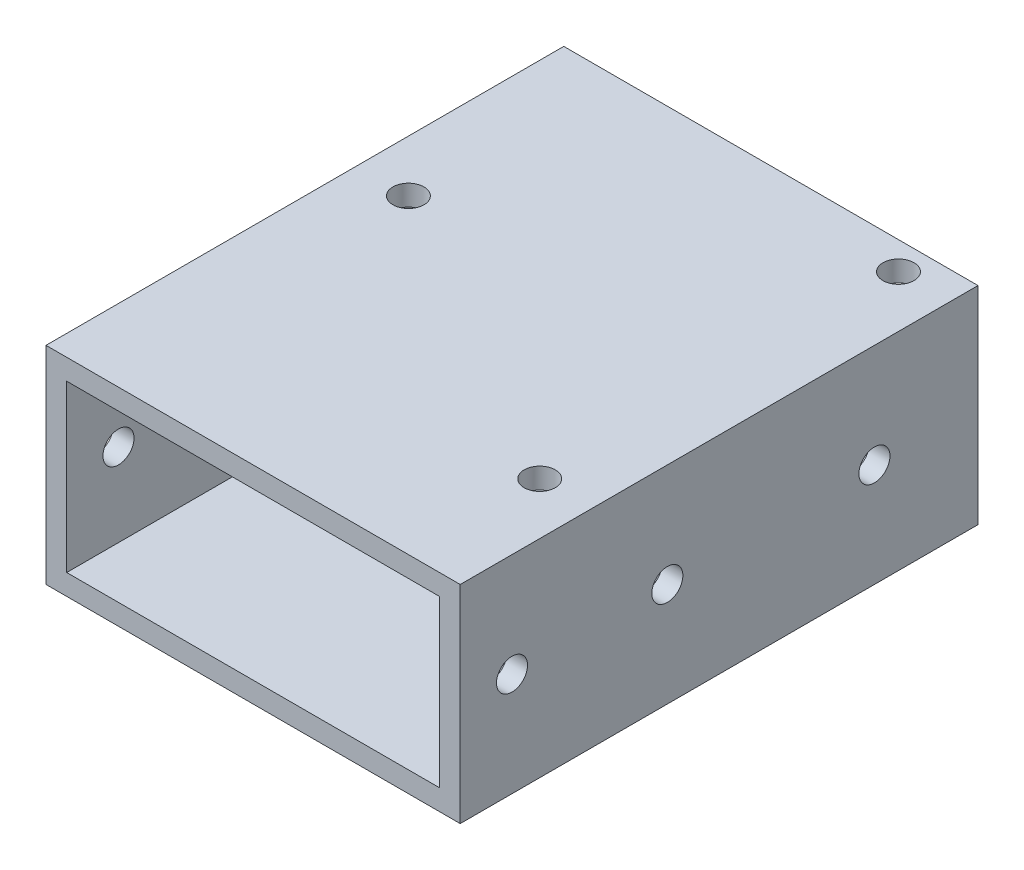
ISO-10303-21;
HEADER;
FILE_DESCRIPTION(('STEP AP214'),'2;1');
FILE_NAME('part.step','',(''),(''),'','','');
FILE_SCHEMA(('AUTOMOTIVE_DESIGN { 1 0 10303 214 1 1 1 1 }'));
ENDSEC;
DATA;
#1=APPLICATION_CONTEXT('core data for automotive mechanical design processes');
#2=APPLICATION_PROTOCOL_DEFINITION('international standard','automotive_design',2000,#1);
#3=PRODUCT_CONTEXT('',#1,'mechanical');
#4=PRODUCT('Part','Part','',(#3));
#5=PRODUCT_RELATED_PRODUCT_CATEGORY('part','',(#4));
#6=PRODUCT_DEFINITION_FORMATION('','',#4);
#7=PRODUCT_DEFINITION_CONTEXT('part definition',#1,'design');
#8=PRODUCT_DEFINITION('design','',#6,#7);
#9=PRODUCT_DEFINITION_SHAPE('','',#8);
#10=(LENGTH_UNIT() NAMED_UNIT(*) SI_UNIT(.MILLI.,.METRE.));
#11=(NAMED_UNIT(*) PLANE_ANGLE_UNIT() SI_UNIT($,.RADIAN.));
#12=(NAMED_UNIT(*) SI_UNIT($,.STERADIAN.) SOLID_ANGLE_UNIT());
#13=UNCERTAINTY_MEASURE_WITH_UNIT(LENGTH_MEASURE(1.E-05),#10,'distance_accuracy_value','');
#14=(GEOMETRIC_REPRESENTATION_CONTEXT(3) GLOBAL_UNCERTAINTY_ASSIGNED_CONTEXT((#13)) GLOBAL_UNIT_ASSIGNED_CONTEXT((#10,
#11,#12)) REPRESENTATION_CONTEXT('',''));
#15=CARTESIAN_POINT('',(0.,0.,0.));
#16=DIRECTION('',(0.,0.,1.));
#17=DIRECTION('',(1.,0.,0.));
#18=AXIS2_PLACEMENT_3D('',#15,#16,#17);
#19=CARTESIAN_POINT('',(0.,0.,50.));
#20=DIRECTION('',(0.,0.,1.));
#21=DIRECTION('',(1.,0.,0.));
#22=AXIS2_PLACEMENT_3D('',#19,#20,#21);
#23=PLANE('',#22);
#24=DIRECTION('',(0.,1.,0.));
#25=VECTOR('',#24,1.);
#26=CARTESIAN_POINT('',(20.,10.,50.));
#27=LINE('',#26,#25);
#28=CARTESIAN_POINT('',(20.,-10.,50.));
#29=VERTEX_POINT('',#28);
#30=CARTESIAN_POINT('',(20.,10.,50.));
#31=VERTEX_POINT('',#30);
#32=EDGE_CURVE('E144',#29,#31,#27,.T.);
#33=ORIENTED_EDGE('',*,*,#32,.T.);
#34=DIRECTION('',(-1.,0.,0.));
#35=VECTOR('',#34,1.);
#36=CARTESIAN_POINT('',(-20.,10.,50.));
#37=LINE('',#36,#35);
#38=CARTESIAN_POINT('',(-20.,10.,50.));
#39=VERTEX_POINT('',#38);
#40=EDGE_CURVE('E146',#31,#39,#37,.T.);
#41=ORIENTED_EDGE('',*,*,#40,.T.);
#42=DIRECTION('',(0.,-1.,0.));
#43=VECTOR('',#42,1.);
#44=CARTESIAN_POINT('',(-20.,10.,50.));
#45=LINE('',#44,#43);
#46=CARTESIAN_POINT('',(-20.,-10.,50.));
#47=VERTEX_POINT('',#46);
#48=EDGE_CURVE('E151',#39,#47,#45,.T.);
#49=ORIENTED_EDGE('',*,*,#48,.T.);
#50=DIRECTION('',(1.,0.,0.));
#51=VECTOR('',#50,1.);
#52=CARTESIAN_POINT('',(-20.,-10.,50.));
#53=LINE('',#52,#51);
#54=EDGE_CURVE('E153',#47,#29,#53,.T.);
#55=ORIENTED_EDGE('',*,*,#54,.T.);
#56=EDGE_LOOP('',(#33,#41,#49,#55));
#57=FACE_BOUND('',#56,.T.);
#58=DIRECTION('',(-1.,0.,0.));
#59=VECTOR('',#58,1.);
#60=CARTESIAN_POINT('',(-18.,8.,50.));
#61=LINE('',#60,#59);
#62=CARTESIAN_POINT('',(18.,8.,50.));
#63=VERTEX_POINT('',#62);
#64=CARTESIAN_POINT('',(-18.,8.,50.));
#65=VERTEX_POINT('',#64);
#66=EDGE_CURVE('E113',#63,#65,#61,.T.);
#67=ORIENTED_EDGE('',*,*,#66,.F.);
#68=DIRECTION('',(0.,1.,0.));
#69=VECTOR('',#68,1.);
#70=CARTESIAN_POINT('',(18.,8.,50.));
#71=LINE('',#70,#69);
#72=CARTESIAN_POINT('',(18.,-8.00000000000001,50.));
#73=VERTEX_POINT('',#72);
#74=EDGE_CURVE('E110',#73,#63,#71,.T.);
#75=ORIENTED_EDGE('',*,*,#74,.F.);
#76=DIRECTION('',(1.,0.,0.));
#77=VECTOR('',#76,1.);
#78=CARTESIAN_POINT('',(-18.,-8.00000000000001,50.));
#79=LINE('',#78,#77);
#80=CARTESIAN_POINT('',(-18.,-8.00000000000001,50.));
#81=VERTEX_POINT('',#80);
#82=EDGE_CURVE('E129',#81,#73,#79,.T.);
#83=ORIENTED_EDGE('',*,*,#82,.F.);
#84=DIRECTION('',(0.,-1.,0.));
#85=VECTOR('',#84,1.);
#86=CARTESIAN_POINT('',(-18.,8.,50.));
#87=LINE('',#86,#85);
#88=EDGE_CURVE('E130',#65,#81,#87,.T.);
#89=ORIENTED_EDGE('',*,*,#88,.F.);
#90=EDGE_LOOP('',(#67,#75,#83,#89));
#91=FACE_BOUND('',#90,.T.);
#92=ADVANCED_FACE('F37',(#57,#91),#23,.T.);
#93=CARTESIAN_POINT('',(0.,0.,0.));
#94=DIRECTION('',(0.,0.,1.));
#95=DIRECTION('',(1.,0.,0.));
#96=AXIS2_PLACEMENT_3D('',#93,#94,#95);
#97=PLANE('',#96);
#98=DIRECTION('',(0.,1.,0.));
#99=VECTOR('',#98,1.);
#100=CARTESIAN_POINT('',(20.,10.,0.));
#101=LINE('',#100,#99);
#102=CARTESIAN_POINT('',(20.,-10.,0.));
#103=VERTEX_POINT('',#102);
#104=CARTESIAN_POINT('',(20.,10.,0.));
#105=VERTEX_POINT('',#104);
#106=EDGE_CURVE('E124',#103,#105,#101,.T.);
#107=ORIENTED_EDGE('',*,*,#106,.F.);
#108=DIRECTION('',(1.,0.,0.));
#109=VECTOR('',#108,1.);
#110=CARTESIAN_POINT('',(-20.,-10.,0.));
#111=LINE('',#110,#109);
#112=CARTESIAN_POINT('',(-20.,-10.,0.));
#113=VERTEX_POINT('',#112);
#114=EDGE_CURVE('E149',#113,#103,#111,.T.);
#115=ORIENTED_EDGE('',*,*,#114,.F.);
#116=DIRECTION('',(0.,-1.,0.));
#117=VECTOR('',#116,1.);
#118=CARTESIAN_POINT('',(-20.,10.,0.));
#119=LINE('',#118,#117);
#120=CARTESIAN_POINT('',(-20.,10.,0.));
#121=VERTEX_POINT('',#120);
#122=EDGE_CURVE('E159',#121,#113,#119,.T.);
#123=ORIENTED_EDGE('',*,*,#122,.F.);
#124=DIRECTION('',(-1.,0.,0.));
#125=VECTOR('',#124,1.);
#126=CARTESIAN_POINT('',(-20.,10.,0.));
#127=LINE('',#126,#125);
#128=EDGE_CURVE('E158',#105,#121,#127,.T.);
#129=ORIENTED_EDGE('',*,*,#128,.F.);
#130=EDGE_LOOP('',(#107,#115,#123,#129));
#131=FACE_BOUND('',#130,.T.);
#132=DIRECTION('',(0.,1.,0.));
#133=VECTOR('',#132,1.);
#134=CARTESIAN_POINT('',(18.,8.,0.));
#135=LINE('',#134,#133);
#136=CARTESIAN_POINT('',(18.,-8.00000000000001,0.));
#137=VERTEX_POINT('',#136);
#138=CARTESIAN_POINT('',(18.,8.,0.));
#139=VERTEX_POINT('',#138);
#140=EDGE_CURVE('E62',#137,#139,#135,.T.);
#141=ORIENTED_EDGE('',*,*,#140,.T.);
#142=DIRECTION('',(-1.,0.,0.));
#143=VECTOR('',#142,1.);
#144=CARTESIAN_POINT('',(-18.,8.,0.));
#145=LINE('',#144,#143);
#146=CARTESIAN_POINT('',(-18.,8.,0.));
#147=VERTEX_POINT('',#146);
#148=EDGE_CURVE('E122',#139,#147,#145,.T.);
#149=ORIENTED_EDGE('',*,*,#148,.T.);
#150=DIRECTION('',(0.,-1.,0.));
#151=VECTOR('',#150,1.);
#152=CARTESIAN_POINT('',(-18.,8.,0.));
#153=LINE('',#152,#151);
#154=CARTESIAN_POINT('',(-18.,-8.00000000000001,0.));
#155=VERTEX_POINT('',#154);
#156=EDGE_CURVE('E137',#147,#155,#153,.T.);
#157=ORIENTED_EDGE('',*,*,#156,.T.);
#158=DIRECTION('',(1.,0.,0.));
#159=VECTOR('',#158,1.);
#160=CARTESIAN_POINT('',(-18.,-8.00000000000001,0.));
#161=LINE('',#160,#159);
#162=EDGE_CURVE('E118',#155,#137,#161,.T.);
#163=ORIENTED_EDGE('',*,*,#162,.T.);
#164=EDGE_LOOP('',(#141,#149,#157,#163));
#165=FACE_BOUND('',#164,.T.);
#166=ADVANCED_FACE('F259',(#131,#165),#97,.F.);
#167=CARTESIAN_POINT('',(20.,10.,50.));
#168=DIRECTION('',(-1.,0.,0.));
#169=DIRECTION('',(0.,-1.,0.));
#170=AXIS2_PLACEMENT_3D('',#167,#168,#169);
#171=PLANE('',#170);
#172=CARTESIAN_POINT('',(20.,0.,10.));
#173=DIRECTION('',(-1.,0.,0.));
#174=DIRECTION('',(0.,-1.,0.));
#175=AXIS2_PLACEMENT_3D('',#172,#173,#174);
#176=CIRCLE('',#175,1.5);
#177=CARTESIAN_POINT('',(20.,-1.5,10.));
#178=VERTEX_POINT('',#177);
#179=EDGE_CURVE('E211',#178,#178,#176,.T.);
#180=ORIENTED_EDGE('',*,*,#179,.T.);
#181=EDGE_LOOP('',(#180));
#182=FACE_BOUND('',#181,.T.);
#183=CARTESIAN_POINT('',(20.,0.,30.));
#184=DIRECTION('',(-1.,0.,0.));
#185=DIRECTION('',(0.,-1.,0.));
#186=AXIS2_PLACEMENT_3D('',#183,#184,#185);
#187=CIRCLE('',#186,1.5);
#188=CARTESIAN_POINT('',(20.,-1.5,30.));
#189=VERTEX_POINT('',#188);
#190=EDGE_CURVE('E198',#189,#189,#187,.T.);
#191=ORIENTED_EDGE('',*,*,#190,.T.);
#192=EDGE_LOOP('',(#191));
#193=FACE_BOUND('',#192,.T.);
#194=CARTESIAN_POINT('',(20.,0.,45.));
#195=DIRECTION('',(-1.,0.,0.));
#196=DIRECTION('',(0.,-1.,0.));
#197=AXIS2_PLACEMENT_3D('',#194,#195,#196);
#198=CIRCLE('',#197,1.5);
#199=CARTESIAN_POINT('',(20.,-1.5,45.));
#200=VERTEX_POINT('',#199);
#201=EDGE_CURVE('E192',#200,#200,#198,.T.);
#202=ORIENTED_EDGE('',*,*,#201,.T.);
#203=EDGE_LOOP('',(#202));
#204=FACE_BOUND('',#203,.T.);
#205=ORIENTED_EDGE('',*,*,#106,.T.);
#206=DIRECTION('',(0.,0.,-1.));
#207=VECTOR('',#206,1.);
#208=CARTESIAN_POINT('',(20.,10.,50.));
#209=LINE('',#208,#207);
#210=EDGE_CURVE('E11',#31,#105,#209,.T.);
#211=ORIENTED_EDGE('',*,*,#210,.F.);
#212=ORIENTED_EDGE('',*,*,#32,.F.);
#213=DIRECTION('',(0.,0.,-1.));
#214=VECTOR('',#213,1.);
#215=CARTESIAN_POINT('',(20.,-10.,50.));
#216=LINE('',#215,#214);
#217=EDGE_CURVE('E154',#29,#103,#216,.T.);
#218=ORIENTED_EDGE('',*,*,#217,.T.);
#219=EDGE_LOOP('',(#205,#211,#212,#218));
#220=FACE_BOUND('',#219,.T.);
#221=ADVANCED_FACE('F45',(#182,#193,#204,#220),#171,.F.);
#222=CARTESIAN_POINT('',(-20.,10.,50.));
#223=DIRECTION('',(0.,-1.,0.));
#224=DIRECTION('',(0.,0.,-1.));
#225=AXIS2_PLACEMENT_3D('',#222,#223,#224);
#226=PLANE('',#225);
#227=CARTESIAN_POINT('',(-15.,10.,20.));
#228=DIRECTION('',(0.,1.,0.));
#229=DIRECTION('',(0.,0.,1.));
#230=AXIS2_PLACEMENT_3D('',#227,#228,#229);
#231=CIRCLE('',#230,1.5);
#232=CARTESIAN_POINT('',(-15.,10.,21.5));
#233=VERTEX_POINT('',#232);
#234=EDGE_CURVE('E174',#233,#233,#231,.T.);
#235=ORIENTED_EDGE('',*,*,#234,.F.);
#236=EDGE_LOOP('',(#235));
#237=FACE_BOUND('',#236,.T.);
#238=CARTESIAN_POINT('',(15.0000000000001,10.,2.67949192431127));
#239=DIRECTION('',(0.,1.,0.));
#240=DIRECTION('',(0.,0.,1.));
#241=AXIS2_PLACEMENT_3D('',#238,#239,#240);
#242=CIRCLE('',#241,1.5);
#243=CARTESIAN_POINT('',(15.0000000000001,10.,4.17949192431127));
#244=VERTEX_POINT('',#243);
#245=EDGE_CURVE('E220',#244,#244,#242,.T.);
#246=ORIENTED_EDGE('',*,*,#245,.F.);
#247=EDGE_LOOP('',(#246));
#248=FACE_BOUND('',#247,.T.);
#249=CARTESIAN_POINT('',(15.0000000000001,10.,37.3205080756887));
#250=DIRECTION('',(0.,1.,0.));
#251=DIRECTION('',(0.,0.,1.));
#252=AXIS2_PLACEMENT_3D('',#249,#250,#251);
#253=CIRCLE('',#252,1.5);
#254=CARTESIAN_POINT('',(15.0000000000001,10.,38.8205080756887));
#255=VERTEX_POINT('',#254);
#256=EDGE_CURVE('E212',#255,#255,#253,.T.);
#257=ORIENTED_EDGE('',*,*,#256,.F.);
#258=EDGE_LOOP('',(#257));
#259=FACE_BOUND('',#258,.T.);
#260=ORIENTED_EDGE('',*,*,#128,.T.);
#261=DIRECTION('',(0.,0.,-1.));
#262=VECTOR('',#261,1.);
#263=CARTESIAN_POINT('',(-20.,10.,50.));
#264=LINE('',#263,#262);
#265=EDGE_CURVE('E47',#39,#121,#264,.T.);
#266=ORIENTED_EDGE('',*,*,#265,.F.);
#267=ORIENTED_EDGE('',*,*,#40,.F.);
#268=ORIENTED_EDGE('',*,*,#210,.T.);
#269=EDGE_LOOP('',(#260,#266,#267,#268));
#270=FACE_BOUND('',#269,.T.);
#271=ADVANCED_FACE('F273',(#237,#248,#259,#270),#226,.F.);
#272=CARTESIAN_POINT('',(-20.,10.,50.));
#273=DIRECTION('',(1.,0.,0.));
#274=DIRECTION('',(0.,1.,0.));
#275=AXIS2_PLACEMENT_3D('',#272,#273,#274);
#276=PLANE('',#275);
#277=CARTESIAN_POINT('',(-20.,0.,10.));
#278=DIRECTION('',(-1.,0.,0.));
#279=DIRECTION('',(0.,-1.,0.));
#280=AXIS2_PLACEMENT_3D('',#277,#278,#279);
#281=CIRCLE('',#280,1.5);
#282=CARTESIAN_POINT('',(-20.,-1.5,10.));
#283=VERTEX_POINT('',#282);
#284=EDGE_CURVE('E186',#283,#283,#281,.T.);
#285=ORIENTED_EDGE('',*,*,#284,.F.);
#286=EDGE_LOOP('',(#285));
#287=FACE_BOUND('',#286,.T.);
#288=CARTESIAN_POINT('',(-20.,0.,30.));
#289=DIRECTION('',(-1.,0.,0.));
#290=DIRECTION('',(0.,-1.,0.));
#291=AXIS2_PLACEMENT_3D('',#288,#289,#290);
#292=CIRCLE('',#291,1.5);
#293=CARTESIAN_POINT('',(-20.,-1.50000000000001,30.));
#294=VERTEX_POINT('',#293);
#295=EDGE_CURVE('E488',#294,#294,#292,.T.);
#296=ORIENTED_EDGE('',*,*,#295,.F.);
#297=EDGE_LOOP('',(#296));
#298=FACE_BOUND('',#297,.T.);
#299=CARTESIAN_POINT('',(-20.,0.,45.));
#300=DIRECTION('',(-1.,0.,0.));
#301=DIRECTION('',(0.,-1.,0.));
#302=AXIS2_PLACEMENT_3D('',#299,#300,#301);
#303=CIRCLE('',#302,1.5);
#304=CARTESIAN_POINT('',(-20.,-1.50000000000001,45.));
#305=VERTEX_POINT('',#304);
#306=EDGE_CURVE('E491',#305,#305,#303,.T.);
#307=ORIENTED_EDGE('',*,*,#306,.F.);
#308=EDGE_LOOP('',(#307));
#309=FACE_BOUND('',#308,.T.);
#310=ORIENTED_EDGE('',*,*,#122,.T.);
#311=DIRECTION('',(0.,0.,-1.));
#312=VECTOR('',#311,1.);
#313=CARTESIAN_POINT('',(-20.,-10.,50.));
#314=LINE('',#313,#312);
#315=EDGE_CURVE('E164',#47,#113,#314,.T.);
#316=ORIENTED_EDGE('',*,*,#315,.F.);
#317=ORIENTED_EDGE('',*,*,#48,.F.);
#318=ORIENTED_EDGE('',*,*,#265,.T.);
#319=EDGE_LOOP('',(#310,#316,#317,#318));
#320=FACE_BOUND('',#319,.T.);
#321=ADVANCED_FACE('F275',(#287,#298,#309,#320),#276,.F.);
#322=CARTESIAN_POINT('',(-20.,-10.,50.));
#323=DIRECTION('',(0.,1.,0.));
#324=DIRECTION('',(0.,0.,1.));
#325=AXIS2_PLACEMENT_3D('',#322,#323,#324);
#326=PLANE('',#325);
#327=CARTESIAN_POINT('',(-15.,-10.,20.));
#328=DIRECTION('',(0.,1.,0.));
#329=DIRECTION('',(0.,0.,1.));
#330=AXIS2_PLACEMENT_3D('',#327,#328,#329);
#331=CIRCLE('',#330,1.5);
#332=CARTESIAN_POINT('',(-15.,-10.,21.5));
#333=VERTEX_POINT('',#332);
#334=EDGE_CURVE('E132',#333,#333,#331,.T.);
#335=ORIENTED_EDGE('',*,*,#334,.T.);
#336=EDGE_LOOP('',(#335));
#337=FACE_BOUND('',#336,.T.);
#338=CARTESIAN_POINT('',(15.0000000000001,-10.,2.67949192431127));
#339=DIRECTION('',(0.,1.,0.));
#340=DIRECTION('',(0.,0.,1.));
#341=AXIS2_PLACEMENT_3D('',#338,#339,#340);
#342=CIRCLE('',#341,1.5);
#343=CARTESIAN_POINT('',(15.0000000000001,-10.,4.17949192431127));
#344=VERTEX_POINT('',#343);
#345=EDGE_CURVE('E184',#344,#344,#342,.T.);
#346=ORIENTED_EDGE('',*,*,#345,.T.);
#347=EDGE_LOOP('',(#346));
#348=FACE_BOUND('',#347,.T.);
#349=CARTESIAN_POINT('',(15.0000000000001,-10.,37.3205080756887));
#350=DIRECTION('',(0.,1.,0.));
#351=DIRECTION('',(0.,0.,1.));
#352=AXIS2_PLACEMENT_3D('',#349,#350,#351);
#353=CIRCLE('',#352,1.5);
#354=CARTESIAN_POINT('',(15.0000000000001,-10.,38.8205080756887));
#355=VERTEX_POINT('',#354);
#356=EDGE_CURVE('E178',#355,#355,#353,.T.);
#357=ORIENTED_EDGE('',*,*,#356,.T.);
#358=EDGE_LOOP('',(#357));
#359=FACE_BOUND('',#358,.T.);
#360=ORIENTED_EDGE('',*,*,#114,.T.);
#361=ORIENTED_EDGE('',*,*,#217,.F.);
#362=ORIENTED_EDGE('',*,*,#54,.F.);
#363=ORIENTED_EDGE('',*,*,#315,.T.);
#364=EDGE_LOOP('',(#360,#361,#362,#363));
#365=FACE_BOUND('',#364,.T.);
#366=ADVANCED_FACE('F233',(#337,#348,#359,#365),#326,.F.);
#367=CARTESIAN_POINT('',(18.,8.,50.));
#368=DIRECTION('',(-1.,0.,0.));
#369=DIRECTION('',(0.,0.,1.));
#370=AXIS2_PLACEMENT_3D('',#367,#368,#369);
#371=PLANE('',#370);
#372=CARTESIAN_POINT('',(18.,0.,10.));
#373=DIRECTION('',(-1.,0.,0.));
#374=DIRECTION('',(0.,0.,1.));
#375=AXIS2_PLACEMENT_3D('',#372,#373,#374);
#376=CIRCLE('',#375,1.5);
#377=CARTESIAN_POINT('',(18.,0.,11.5));
#378=VERTEX_POINT('',#377);
#379=EDGE_CURVE('E208',#378,#378,#376,.T.);
#380=ORIENTED_EDGE('',*,*,#379,.F.);
#381=EDGE_LOOP('',(#380));
#382=FACE_BOUND('',#381,.T.);
#383=CARTESIAN_POINT('',(18.,0.,30.));
#384=DIRECTION('',(-1.,0.,0.));
#385=DIRECTION('',(0.,0.,1.));
#386=AXIS2_PLACEMENT_3D('',#383,#384,#385);
#387=CIRCLE('',#386,1.5);
#388=CARTESIAN_POINT('',(18.,0.,31.5));
#389=VERTEX_POINT('',#388);
#390=EDGE_CURVE('E191',#389,#389,#387,.T.);
#391=ORIENTED_EDGE('',*,*,#390,.F.);
#392=EDGE_LOOP('',(#391));
#393=FACE_BOUND('',#392,.T.);
#394=CARTESIAN_POINT('',(18.,0.,45.));
#395=DIRECTION('',(-1.,0.,0.));
#396=DIRECTION('',(0.,0.,1.));
#397=AXIS2_PLACEMENT_3D('',#394,#395,#396);
#398=CIRCLE('',#397,1.5);
#399=CARTESIAN_POINT('',(18.,0.,46.5));
#400=VERTEX_POINT('',#399);
#401=EDGE_CURVE('E190',#400,#400,#398,.T.);
#402=ORIENTED_EDGE('',*,*,#401,.F.);
#403=EDGE_LOOP('',(#402));
#404=FACE_BOUND('',#403,.T.);
#405=ORIENTED_EDGE('',*,*,#140,.F.);
#406=DIRECTION('',(0.,0.,-1.));
#407=VECTOR('',#406,1.);
#408=CARTESIAN_POINT('',(18.,-8.00000000000001,50.));
#409=LINE('',#408,#407);
#410=EDGE_CURVE('E112',#73,#137,#409,.T.);
#411=ORIENTED_EDGE('',*,*,#410,.F.);
#412=ORIENTED_EDGE('',*,*,#74,.T.);
#413=DIRECTION('',(0.,0.,-1.));
#414=VECTOR('',#413,1.);
#415=CARTESIAN_POINT('',(18.,8.,50.));
#416=LINE('',#415,#414);
#417=EDGE_CURVE('E109',#63,#139,#416,.T.);
#418=ORIENTED_EDGE('',*,*,#417,.T.);
#419=EDGE_LOOP('',(#405,#411,#412,#418));
#420=FACE_BOUND('',#419,.T.);
#421=ADVANCED_FACE('F108',(#382,#393,#404,#420),#371,.T.);
#422=CARTESIAN_POINT('',(-18.,8.,50.));
#423=DIRECTION('',(0.,-1.,0.));
#424=DIRECTION('',(0.,0.,-1.));
#425=AXIS2_PLACEMENT_3D('',#422,#423,#424);
#426=PLANE('',#425);
#427=CARTESIAN_POINT('',(-15.,8.,20.));
#428=DIRECTION('',(0.,-1.,0.));
#429=DIRECTION('',(0.,0.,-1.));
#430=AXIS2_PLACEMENT_3D('',#427,#428,#429);
#431=CIRCLE('',#430,1.5);
#432=CARTESIAN_POINT('',(-15.,8.,18.5));
#433=VERTEX_POINT('',#432);
#434=EDGE_CURVE('E181',#433,#433,#431,.T.);
#435=ORIENTED_EDGE('',*,*,#434,.F.);
#436=EDGE_LOOP('',(#435));
#437=FACE_BOUND('',#436,.T.);
#438=CARTESIAN_POINT('',(15.0000000000001,8.,2.67949192431127));
#439=DIRECTION('',(0.,-1.,0.));
#440=DIRECTION('',(0.,0.,-1.));
#441=AXIS2_PLACEMENT_3D('',#438,#439,#440);
#442=CIRCLE('',#441,1.5);
#443=CARTESIAN_POINT('',(15.0000000000001,8.,1.17949192431128));
#444=VERTEX_POINT('',#443);
#445=EDGE_CURVE('E179',#444,#444,#442,.T.);
#446=ORIENTED_EDGE('',*,*,#445,.F.);
#447=EDGE_LOOP('',(#446));
#448=FACE_BOUND('',#447,.T.);
#449=CARTESIAN_POINT('',(15.0000000000001,8.,37.3205080756887));
#450=DIRECTION('',(0.,-1.,0.));
#451=DIRECTION('',(0.,0.,-1.));
#452=AXIS2_PLACEMENT_3D('',#449,#450,#451);
#453=CIRCLE('',#452,1.5);
#454=CARTESIAN_POINT('',(15.0000000000001,8.,35.8205080756887));
#455=VERTEX_POINT('',#454);
#456=EDGE_CURVE('E171',#455,#455,#453,.T.);
#457=ORIENTED_EDGE('',*,*,#456,.F.);
#458=EDGE_LOOP('',(#457));
#459=FACE_BOUND('',#458,.T.);
#460=ORIENTED_EDGE('',*,*,#148,.F.);
#461=ORIENTED_EDGE('',*,*,#417,.F.);
#462=ORIENTED_EDGE('',*,*,#66,.T.);
#463=DIRECTION('',(0.,0.,-1.));
#464=VECTOR('',#463,1.);
#465=CARTESIAN_POINT('',(-18.,8.,50.));
#466=LINE('',#465,#464);
#467=EDGE_CURVE('E123',#65,#147,#466,.T.);
#468=ORIENTED_EDGE('',*,*,#467,.T.);
#469=EDGE_LOOP('',(#460,#461,#462,#468));
#470=FACE_BOUND('',#469,.T.);
#471=ADVANCED_FACE('F119',(#437,#448,#459,#470),#426,.T.);
#472=CARTESIAN_POINT('',(-18.,8.,50.));
#473=DIRECTION('',(1.,0.,0.));
#474=DIRECTION('',(0.,0.,-1.));
#475=AXIS2_PLACEMENT_3D('',#472,#473,#474);
#476=PLANE('',#475);
#477=CARTESIAN_POINT('',(-18.,0.,10.));
#478=DIRECTION('',(1.,0.,0.));
#479=DIRECTION('',(0.,0.,-1.));
#480=AXIS2_PLACEMENT_3D('',#477,#478,#479);
#481=CIRCLE('',#480,1.5);
#482=CARTESIAN_POINT('',(-18.,0.,8.5));
#483=VERTEX_POINT('',#482);
#484=EDGE_CURVE('E42',#483,#483,#481,.T.);
#485=ORIENTED_EDGE('',*,*,#484,.F.);
#486=EDGE_LOOP('',(#485));
#487=FACE_BOUND('',#486,.T.);
#488=CARTESIAN_POINT('',(-18.,0.,30.));
#489=DIRECTION('',(1.,0.,0.));
#490=DIRECTION('',(0.,0.,-1.));
#491=AXIS2_PLACEMENT_3D('',#488,#489,#490);
#492=CIRCLE('',#491,1.5);
#493=CARTESIAN_POINT('',(-18.,0.,28.5));
#494=VERTEX_POINT('',#493);
#495=EDGE_CURVE('E189',#494,#494,#492,.T.);
#496=ORIENTED_EDGE('',*,*,#495,.F.);
#497=EDGE_LOOP('',(#496));
#498=FACE_BOUND('',#497,.T.);
#499=CARTESIAN_POINT('',(-18.,0.,45.));
#500=DIRECTION('',(1.,0.,0.));
#501=DIRECTION('',(0.,0.,-1.));
#502=AXIS2_PLACEMENT_3D('',#499,#500,#501);
#503=CIRCLE('',#502,1.5);
#504=CARTESIAN_POINT('',(-18.,0.,43.5));
#505=VERTEX_POINT('',#504);
#506=EDGE_CURVE('E183',#505,#505,#503,.T.);
#507=ORIENTED_EDGE('',*,*,#506,.F.);
#508=EDGE_LOOP('',(#507));
#509=FACE_BOUND('',#508,.T.);
#510=ORIENTED_EDGE('',*,*,#156,.F.);
#511=ORIENTED_EDGE('',*,*,#467,.F.);
#512=ORIENTED_EDGE('',*,*,#88,.T.);
#513=DIRECTION('',(0.,0.,-1.));
#514=VECTOR('',#513,1.);
#515=CARTESIAN_POINT('',(-18.,-8.00000000000001,50.));
#516=LINE('',#515,#514);
#517=EDGE_CURVE('E60',#81,#155,#516,.T.);
#518=ORIENTED_EDGE('',*,*,#517,.T.);
#519=EDGE_LOOP('',(#510,#511,#512,#518));
#520=FACE_BOUND('',#519,.T.);
#521=ADVANCED_FACE('F305',(#487,#498,#509,#520),#476,.T.);
#522=CARTESIAN_POINT('',(-18.,-8.00000000000001,50.));
#523=DIRECTION('',(0.,1.,0.));
#524=DIRECTION('',(0.,0.,1.));
#525=AXIS2_PLACEMENT_3D('',#522,#523,#524);
#526=PLANE('',#525);
#527=CARTESIAN_POINT('',(-15.,-8.00000000000001,20.));
#528=DIRECTION('',(0.,1.,0.));
#529=DIRECTION('',(0.,0.,1.));
#530=AXIS2_PLACEMENT_3D('',#527,#528,#529);
#531=CIRCLE('',#530,1.5);
#532=CARTESIAN_POINT('',(-15.,-8.00000000000001,21.5));
#533=VERTEX_POINT('',#532);
#534=EDGE_CURVE('E180',#533,#533,#531,.T.);
#535=ORIENTED_EDGE('',*,*,#534,.F.);
#536=EDGE_LOOP('',(#535));
#537=FACE_BOUND('',#536,.T.);
#538=CARTESIAN_POINT('',(15.0000000000001,-8.00000000000001,2.67949192431127));
#539=DIRECTION('',(0.,1.,0.));
#540=DIRECTION('',(0.,0.,1.));
#541=AXIS2_PLACEMENT_3D('',#538,#539,#540);
#542=CIRCLE('',#541,1.5);
#543=CARTESIAN_POINT('',(15.0000000000001,-8.00000000000001,4.17949192431127));
#544=VERTEX_POINT('',#543);
#545=EDGE_CURVE('E172',#544,#544,#542,.T.);
#546=ORIENTED_EDGE('',*,*,#545,.F.);
#547=EDGE_LOOP('',(#546));
#548=FACE_BOUND('',#547,.T.);
#549=CARTESIAN_POINT('',(15.0000000000001,-8.00000000000001,37.3205080756887));
#550=DIRECTION('',(0.,1.,0.));
#551=DIRECTION('',(0.,0.,1.));
#552=AXIS2_PLACEMENT_3D('',#549,#550,#551);
#553=CIRCLE('',#552,1.5);
#554=CARTESIAN_POINT('',(15.0000000000001,-8.00000000000001,38.8205080756887));
#555=VERTEX_POINT('',#554);
#556=EDGE_CURVE('E168',#555,#555,#553,.T.);
#557=ORIENTED_EDGE('',*,*,#556,.F.);
#558=EDGE_LOOP('',(#557));
#559=FACE_BOUND('',#558,.T.);
#560=ORIENTED_EDGE('',*,*,#162,.F.);
#561=ORIENTED_EDGE('',*,*,#517,.F.);
#562=ORIENTED_EDGE('',*,*,#82,.T.);
#563=ORIENTED_EDGE('',*,*,#410,.T.);
#564=EDGE_LOOP('',(#560,#561,#562,#563));
#565=FACE_BOUND('',#564,.T.);
#566=ADVANCED_FACE('F304',(#537,#548,#559,#565),#526,.T.);
#567=CARTESIAN_POINT('',(15.0000000000001,-40.,37.3205080756887));
#568=DIRECTION('',(0.,1.,0.));
#569=DIRECTION('',(0.,0.,1.));
#570=AXIS2_PLACEMENT_3D('',#567,#568,#569);
#571=CYLINDRICAL_SURFACE('',#570,1.5);
#572=ORIENTED_EDGE('',*,*,#556,.T.);
#573=EDGE_LOOP('',(#572));
#574=FACE_BOUND('',#573,.T.);
#575=ORIENTED_EDGE('',*,*,#356,.F.);
#576=EDGE_LOOP('',(#575));
#577=FACE_BOUND('',#576,.T.);
#578=ADVANCED_FACE('F253',(#574,#577),#571,.F.);
#579=CARTESIAN_POINT('',(15.0000000000001,-40.,2.67949192431127));
#580=DIRECTION('',(0.,1.,0.));
#581=DIRECTION('',(0.,0.,1.));
#582=AXIS2_PLACEMENT_3D('',#579,#580,#581);
#583=CYLINDRICAL_SURFACE('',#582,1.5);
#584=ORIENTED_EDGE('',*,*,#545,.T.);
#585=EDGE_LOOP('',(#584));
#586=FACE_BOUND('',#585,.T.);
#587=ORIENTED_EDGE('',*,*,#345,.F.);
#588=EDGE_LOOP('',(#587));
#589=FACE_BOUND('',#588,.T.);
#590=ADVANCED_FACE('F238',(#586,#589),#583,.F.);
#591=CARTESIAN_POINT('',(-15.,-40.,20.));
#592=DIRECTION('',(0.,1.,0.));
#593=DIRECTION('',(0.,0.,1.));
#594=AXIS2_PLACEMENT_3D('',#591,#592,#593);
#595=CYLINDRICAL_SURFACE('',#594,1.5);
#596=ORIENTED_EDGE('',*,*,#534,.T.);
#597=EDGE_LOOP('',(#596));
#598=FACE_BOUND('',#597,.T.);
#599=ORIENTED_EDGE('',*,*,#334,.F.);
#600=EDGE_LOOP('',(#599));
#601=FACE_BOUND('',#600,.T.);
#602=ADVANCED_FACE('F240',(#598,#601),#595,.F.);
#603=ORIENTED_EDGE('',*,*,#456,.T.);
#604=EDGE_LOOP('',(#603));
#605=FACE_BOUND('',#604,.T.);
#606=ORIENTED_EDGE('',*,*,#256,.T.);
#607=EDGE_LOOP('',(#606));
#608=FACE_BOUND('',#607,.T.);
#609=ADVANCED_FACE('F239',(#605,#608),#571,.F.);
#610=ORIENTED_EDGE('',*,*,#445,.T.);
#611=EDGE_LOOP('',(#610));
#612=FACE_BOUND('',#611,.T.);
#613=ORIENTED_EDGE('',*,*,#245,.T.);
#614=EDGE_LOOP('',(#613));
#615=FACE_BOUND('',#614,.T.);
#616=ADVANCED_FACE('F249',(#612,#615),#583,.F.);
#617=ORIENTED_EDGE('',*,*,#434,.T.);
#618=EDGE_LOOP('',(#617));
#619=FACE_BOUND('',#618,.T.);
#620=ORIENTED_EDGE('',*,*,#234,.T.);
#621=EDGE_LOOP('',(#620));
#622=FACE_BOUND('',#621,.T.);
#623=ADVANCED_FACE('F241',(#619,#622),#595,.F.);
#624=CARTESIAN_POINT('',(30.,0.,45.));
#625=DIRECTION('',(-1.,0.,0.));
#626=DIRECTION('',(0.,-1.,0.));
#627=AXIS2_PLACEMENT_3D('',#624,#625,#626);
#628=CYLINDRICAL_SURFACE('',#627,1.5);
#629=ORIENTED_EDGE('',*,*,#506,.T.);
#630=EDGE_LOOP('',(#629));
#631=FACE_BOUND('',#630,.T.);
#632=ORIENTED_EDGE('',*,*,#306,.T.);
#633=EDGE_LOOP('',(#632));
#634=FACE_BOUND('',#633,.T.);
#635=ADVANCED_FACE('F258',(#631,#634),#628,.F.);
#636=CARTESIAN_POINT('',(30.,0.,30.));
#637=DIRECTION('',(-1.,0.,0.));
#638=DIRECTION('',(0.,-1.,0.));
#639=AXIS2_PLACEMENT_3D('',#636,#637,#638);
#640=CYLINDRICAL_SURFACE('',#639,1.5);
#641=ORIENTED_EDGE('',*,*,#495,.T.);
#642=EDGE_LOOP('',(#641));
#643=FACE_BOUND('',#642,.T.);
#644=ORIENTED_EDGE('',*,*,#295,.T.);
#645=EDGE_LOOP('',(#644));
#646=FACE_BOUND('',#645,.T.);
#647=ADVANCED_FACE('F367',(#643,#646),#640,.F.);
#648=CARTESIAN_POINT('',(30.,0.,10.));
#649=DIRECTION('',(-1.,0.,0.));
#650=DIRECTION('',(0.,-1.,0.));
#651=AXIS2_PLACEMENT_3D('',#648,#649,#650);
#652=CYLINDRICAL_SURFACE('',#651,1.5);
#653=ORIENTED_EDGE('',*,*,#484,.T.);
#654=EDGE_LOOP('',(#653));
#655=FACE_BOUND('',#654,.T.);
#656=ORIENTED_EDGE('',*,*,#284,.T.);
#657=EDGE_LOOP('',(#656));
#658=FACE_BOUND('',#657,.T.);
#659=ADVANCED_FACE('F377',(#655,#658),#652,.F.);
#660=ORIENTED_EDGE('',*,*,#401,.T.);
#661=EDGE_LOOP('',(#660));
#662=FACE_BOUND('',#661,.T.);
#663=ORIENTED_EDGE('',*,*,#201,.F.);
#664=EDGE_LOOP('',(#663));
#665=FACE_BOUND('',#664,.T.);
#666=ADVANCED_FACE('F375',(#662,#665),#628,.F.);
#667=ORIENTED_EDGE('',*,*,#390,.T.);
#668=EDGE_LOOP('',(#667));
#669=FACE_BOUND('',#668,.T.);
#670=ORIENTED_EDGE('',*,*,#190,.F.);
#671=EDGE_LOOP('',(#670));
#672=FACE_BOUND('',#671,.T.);
#673=ADVANCED_FACE('F381',(#669,#672),#640,.F.);
#674=ORIENTED_EDGE('',*,*,#379,.T.);
#675=EDGE_LOOP('',(#674));
#676=FACE_BOUND('',#675,.T.);
#677=ORIENTED_EDGE('',*,*,#179,.F.);
#678=EDGE_LOOP('',(#677));
#679=FACE_BOUND('',#678,.T.);
#680=ADVANCED_FACE('F388',(#676,#679),#652,.F.);
#681=CLOSED_SHELL('',(#92,#166,#221,#271,#321,#366,#421,#471,#521,#566,#578,#590,#602,#609,#616,
#623,#635,#647,#659,#666,#673,#680));
#682=MANIFOLD_SOLID_BREP('B2',#681);
#683=ADVANCED_BREP_SHAPE_REPRESENTATION('',(#18,#682),#14);
#684=SHAPE_DEFINITION_REPRESENTATION(#9,#683);
ENDSEC;
END-ISO-10303-21;
